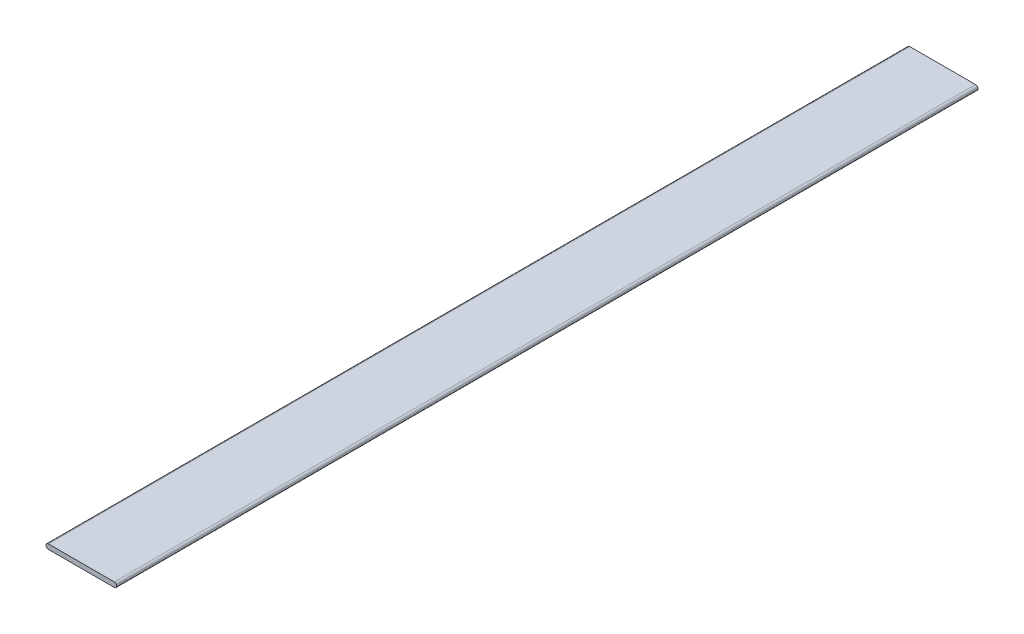
ISO-10303-21;
HEADER;
FILE_DESCRIPTION(('STEP AP214'),'2;1');
FILE_NAME('part.step','',(''),(''),'','','');
FILE_SCHEMA(('AUTOMOTIVE_DESIGN { 1 0 10303 214 1 1 1 1 }'));
ENDSEC;
DATA;
#1=APPLICATION_CONTEXT('core data for automotive mechanical design processes');
#2=APPLICATION_PROTOCOL_DEFINITION('international standard','automotive_design',2000,#1);
#3=PRODUCT_CONTEXT('',#1,'mechanical');
#4=PRODUCT('Part','Part','',(#3));
#5=PRODUCT_RELATED_PRODUCT_CATEGORY('part','',(#4));
#6=PRODUCT_DEFINITION_FORMATION('','',#4);
#7=PRODUCT_DEFINITION_CONTEXT('part definition',#1,'design');
#8=PRODUCT_DEFINITION('design','',#6,#7);
#9=PRODUCT_DEFINITION_SHAPE('','',#8);
#10=(LENGTH_UNIT() NAMED_UNIT(*) SI_UNIT(.MILLI.,.METRE.));
#11=(NAMED_UNIT(*) PLANE_ANGLE_UNIT() SI_UNIT($,.RADIAN.));
#12=(NAMED_UNIT(*) SI_UNIT($,.STERADIAN.) SOLID_ANGLE_UNIT());
#13=UNCERTAINTY_MEASURE_WITH_UNIT(LENGTH_MEASURE(1.E-05),#10,'distance_accuracy_value','');
#14=(GEOMETRIC_REPRESENTATION_CONTEXT(3) GLOBAL_UNCERTAINTY_ASSIGNED_CONTEXT((#13)) GLOBAL_UNIT_ASSIGNED_CONTEXT((#10,
#11,#12)) REPRESENTATION_CONTEXT('',''));
#15=CARTESIAN_POINT('',(0.,0.,0.));
#16=DIRECTION('',(0.,0.,1.));
#17=DIRECTION('',(1.,0.,0.));
#18=AXIS2_PLACEMENT_3D('',#15,#16,#17);
#19=CARTESIAN_POINT('',(-5.4072463768116,0.,250.));
#20=DIRECTION('',(0.,0.,-1.));
#21=DIRECTION('',(-1.,0.,0.));
#22=AXIS2_PLACEMENT_3D('',#19,#20,#21);
#23=CYLINDRICAL_SURFACE('',#22,0.7);
#24=CARTESIAN_POINT('',(-5.4072463768116,0.,0.));
#25=DIRECTION('',(0.,0.,1.));
#26=DIRECTION('',(1.,0.,0.));
#27=AXIS2_PLACEMENT_3D('',#24,#25,#26);
#28=CIRCLE('',#27,0.7);
#29=CARTESIAN_POINT('',(-5.4072463768116,0.7,0.));
#30=VERTEX_POINT('',#29);
#31=CARTESIAN_POINT('',(-5.4072463768116,-0.7,0.));
#32=VERTEX_POINT('',#31);
#33=EDGE_CURVE('E102',#30,#32,#28,.T.);
#34=ORIENTED_EDGE('',*,*,#33,.T.);
#35=DIRECTION('',(0.,0.,-1.));
#36=VECTOR('',#35,1.);
#37=CARTESIAN_POINT('',(-5.4072463768116,-0.7,250.));
#38=LINE('',#37,#36);
#39=CARTESIAN_POINT('',(-5.4072463768116,-0.7,250.));
#40=VERTEX_POINT('',#39);
#41=EDGE_CURVE('E11',#40,#32,#38,.T.);
#42=ORIENTED_EDGE('',*,*,#41,.F.);
#43=CARTESIAN_POINT('',(-5.4072463768116,0.,250.));
#44=DIRECTION('',(0.,0.,1.));
#45=DIRECTION('',(1.,0.,0.));
#46=AXIS2_PLACEMENT_3D('',#43,#44,#45);
#47=CIRCLE('',#46,0.7);
#48=CARTESIAN_POINT('',(-5.4072463768116,0.7,250.));
#49=VERTEX_POINT('',#48);
#50=EDGE_CURVE('E90',#49,#40,#47,.T.);
#51=ORIENTED_EDGE('',*,*,#50,.F.);
#52=DIRECTION('',(0.,0.,-1.));
#53=VECTOR('',#52,1.);
#54=CARTESIAN_POINT('',(-5.4072463768116,0.7,250.));
#55=LINE('',#54,#53);
#56=EDGE_CURVE('E98',#49,#30,#55,.T.);
#57=ORIENTED_EDGE('',*,*,#56,.T.);
#58=EDGE_LOOP('',(#34,#42,#51,#57));
#59=FACE_BOUND('',#58,.T.);
#60=ADVANCED_FACE('F39',(#59),#23,.T.);
#61=CARTESIAN_POINT('',(-5.4072463768116,-0.7,250.));
#62=DIRECTION('',(0.,1.,0.));
#63=DIRECTION('',(0.,0.,1.));
#64=AXIS2_PLACEMENT_3D('',#61,#62,#63);
#65=PLANE('',#64);
#66=DIRECTION('',(1.,0.,0.));
#67=VECTOR('',#66,1.);
#68=CARTESIAN_POINT('',(-5.4072463768116,-0.7,0.));
#69=LINE('',#68,#67);
#70=CARTESIAN_POINT('',(13.6927536231884,-0.7,0.));
#71=VERTEX_POINT('',#70);
#72=EDGE_CURVE('E94',#32,#71,#69,.T.);
#73=ORIENTED_EDGE('',*,*,#72,.T.);
#74=DIRECTION('',(0.,0.,-1.));
#75=VECTOR('',#74,1.);
#76=CARTESIAN_POINT('',(13.6927536231884,-0.7,250.));
#77=LINE('',#76,#75);
#78=CARTESIAN_POINT('',(13.6927536231884,-0.7,250.));
#79=VERTEX_POINT('',#78);
#80=EDGE_CURVE('E47',#79,#71,#77,.T.);
#81=ORIENTED_EDGE('',*,*,#80,.F.);
#82=DIRECTION('',(1.,0.,0.));
#83=VECTOR('',#82,1.);
#84=CARTESIAN_POINT('',(-5.4072463768116,-0.7,250.));
#85=LINE('',#84,#83);
#86=EDGE_CURVE('E85',#40,#79,#85,.T.);
#87=ORIENTED_EDGE('',*,*,#86,.F.);
#88=ORIENTED_EDGE('',*,*,#41,.T.);
#89=EDGE_LOOP('',(#73,#81,#87,#88));
#90=FACE_BOUND('',#89,.T.);
#91=ADVANCED_FACE('F93',(#90),#65,.F.);
#92=CARTESIAN_POINT('',(13.6927536231884,0.,250.));
#93=DIRECTION('',(0.,0.,-1.));
#94=DIRECTION('',(-1.,0.,0.));
#95=AXIS2_PLACEMENT_3D('',#92,#93,#94);
#96=CYLINDRICAL_SURFACE('',#95,0.7);
#97=CARTESIAN_POINT('',(13.6927536231884,0.,0.));
#98=DIRECTION('',(0.,0.,1.));
#99=DIRECTION('',(1.,0.,0.));
#100=AXIS2_PLACEMENT_3D('',#97,#98,#99);
#101=CIRCLE('',#100,0.7);
#102=CARTESIAN_POINT('',(13.6927536231884,0.7,0.));
#103=VERTEX_POINT('',#102);
#104=EDGE_CURVE('E72',#71,#103,#101,.T.);
#105=ORIENTED_EDGE('',*,*,#104,.T.);
#106=DIRECTION('',(0.,0.,-1.));
#107=VECTOR('',#106,1.);
#108=CARTESIAN_POINT('',(13.6927536231884,0.7,250.));
#109=LINE('',#108,#107);
#110=CARTESIAN_POINT('',(13.6927536231884,0.7,250.));
#111=VERTEX_POINT('',#110);
#112=EDGE_CURVE('E95',#111,#103,#109,.T.);
#113=ORIENTED_EDGE('',*,*,#112,.F.);
#114=CARTESIAN_POINT('',(13.6927536231884,0.,250.));
#115=DIRECTION('',(0.,0.,1.));
#116=DIRECTION('',(1.,0.,0.));
#117=AXIS2_PLACEMENT_3D('',#114,#115,#116);
#118=CIRCLE('',#117,0.7);
#119=EDGE_CURVE('E88',#79,#111,#118,.T.);
#120=ORIENTED_EDGE('',*,*,#119,.F.);
#121=ORIENTED_EDGE('',*,*,#80,.T.);
#122=EDGE_LOOP('',(#105,#113,#120,#121));
#123=FACE_BOUND('',#122,.T.);
#124=ADVANCED_FACE('F96',(#123),#96,.T.);
#125=CARTESIAN_POINT('',(-5.4072463768116,0.7,250.));
#126=DIRECTION('',(0.,-1.,0.));
#127=DIRECTION('',(0.,0.,-1.));
#128=AXIS2_PLACEMENT_3D('',#125,#126,#127);
#129=PLANE('',#128);
#130=DIRECTION('',(-1.,0.,0.));
#131=VECTOR('',#130,1.);
#132=CARTESIAN_POINT('',(-5.4072463768116,0.7,0.));
#133=LINE('',#132,#131);
#134=EDGE_CURVE('E78',#103,#30,#133,.T.);
#135=ORIENTED_EDGE('',*,*,#134,.T.);
#136=ORIENTED_EDGE('',*,*,#56,.F.);
#137=DIRECTION('',(-1.,0.,0.));
#138=VECTOR('',#137,1.);
#139=CARTESIAN_POINT('',(-5.4072463768116,0.7,250.));
#140=LINE('',#139,#138);
#141=EDGE_CURVE('E55',#111,#49,#140,.T.);
#142=ORIENTED_EDGE('',*,*,#141,.F.);
#143=ORIENTED_EDGE('',*,*,#112,.T.);
#144=EDGE_LOOP('',(#135,#136,#142,#143));
#145=FACE_BOUND('',#144,.T.);
#146=ADVANCED_FACE('F109',(#145),#129,.F.);
#147=CARTESIAN_POINT('',(-5.4072463768116,0.,250.));
#148=DIRECTION('',(0.,0.,1.));
#149=DIRECTION('',(1.,0.,0.));
#150=AXIS2_PLACEMENT_3D('',#147,#148,#149);
#151=PLANE('',#150);
#152=ORIENTED_EDGE('',*,*,#50,.T.);
#153=ORIENTED_EDGE('',*,*,#86,.T.);
#154=ORIENTED_EDGE('',*,*,#119,.T.);
#155=ORIENTED_EDGE('',*,*,#141,.T.);
#156=EDGE_LOOP('',(#152,#153,#154,#155));
#157=FACE_BOUND('',#156,.T.);
#158=ADVANCED_FACE('F86',(#157),#151,.T.);
#159=CARTESIAN_POINT('',(-5.4072463768116,0.,0.));
#160=DIRECTION('',(0.,0.,1.));
#161=DIRECTION('',(1.,0.,0.));
#162=AXIS2_PLACEMENT_3D('',#159,#160,#161);
#163=PLANE('',#162);
#164=ORIENTED_EDGE('',*,*,#33,.F.);
#165=ORIENTED_EDGE('',*,*,#134,.F.);
#166=ORIENTED_EDGE('',*,*,#104,.F.);
#167=ORIENTED_EDGE('',*,*,#72,.F.);
#168=EDGE_LOOP('',(#164,#165,#166,#167));
#169=FACE_BOUND('',#168,.T.);
#170=ADVANCED_FACE('F112',(#169),#163,.F.);
#171=CLOSED_SHELL('',(#60,#91,#124,#146,#158,#170));
#172=MANIFOLD_SOLID_BREP('B2',#171);
#173=ADVANCED_BREP_SHAPE_REPRESENTATION('',(#18,#172),#14);
#174=SHAPE_DEFINITION_REPRESENTATION(#9,#173);
ENDSEC;
END-ISO-10303-21;
